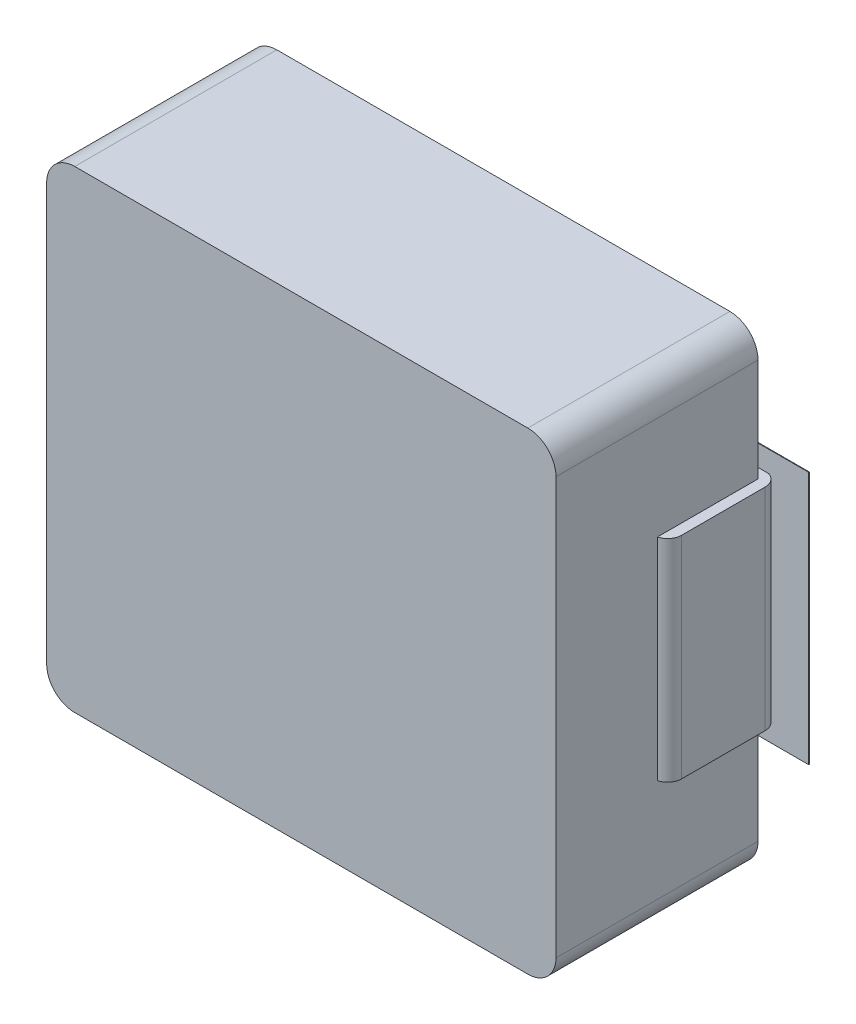
ISO-10303-21;
HEADER;
FILE_DESCRIPTION(('STEP AP214'),'2;1');
FILE_NAME('part.step','',(''),(''),'','','');
FILE_SCHEMA(('AUTOMOTIVE_DESIGN { 1 0 10303 214 1 1 1 1 }'));
ENDSEC;
DATA;
#1=APPLICATION_CONTEXT('core data for automotive mechanical design processes');
#2=APPLICATION_PROTOCOL_DEFINITION('international standard','automotive_design',2000,#1);
#3=PRODUCT_CONTEXT('',#1,'mechanical');
#4=PRODUCT('Part','Part','',(#3));
#5=PRODUCT_RELATED_PRODUCT_CATEGORY('part','',(#4));
#6=PRODUCT_DEFINITION_FORMATION('','',#4);
#7=PRODUCT_DEFINITION_CONTEXT('part definition',#1,'design');
#8=PRODUCT_DEFINITION('design','',#6,#7);
#9=PRODUCT_DEFINITION_SHAPE('','',#8);
#10=(LENGTH_UNIT() NAMED_UNIT(*) SI_UNIT(.MILLI.,.METRE.));
#11=(NAMED_UNIT(*) PLANE_ANGLE_UNIT() SI_UNIT($,.RADIAN.));
#12=(NAMED_UNIT(*) SI_UNIT($,.STERADIAN.) SOLID_ANGLE_UNIT());
#13=UNCERTAINTY_MEASURE_WITH_UNIT(LENGTH_MEASURE(1.E-05),#10,'distance_accuracy_value','');
#14=(GEOMETRIC_REPRESENTATION_CONTEXT(3) GLOBAL_UNCERTAINTY_ASSIGNED_CONTEXT((#13)) GLOBAL_UNIT_ASSIGNED_CONTEXT((#10,
#11,#12)) REPRESENTATION_CONTEXT('',''));
#15=CARTESIAN_POINT('',(0.,0.,0.));
#16=DIRECTION('',(0.,0.,1.));
#17=DIRECTION('',(1.,0.,0.));
#18=AXIS2_PLACEMENT_3D('',#15,#16,#17);
#19=CARTESIAN_POINT('',(3.57099999999994,-1.5000000000001,0.0762));
#20=DIRECTION('',(0.,0.,-1.));
#21=DIRECTION('',(-1.,0.,0.));
#22=AXIS2_PLACEMENT_3D('',#19,#20,#21);
#23=PLANE('',#22);
#24=DIRECTION('',(0.,1.,0.));
#25=VECTOR('',#24,1.);
#26=CARTESIAN_POINT('',(4.20000000000098,-1.79999999999991,0.0762));
#27=LINE('',#26,#25);
#28=CARTESIAN_POINT('',(4.20000000000098,-1.79999999999991,0.0762));
#29=VERTEX_POINT('',#28);
#30=CARTESIAN_POINT('',(4.20000000000098,1.79999999999991,0.0762));
#31=VERTEX_POINT('',#30);
#32=EDGE_CURVE('E1210',#29,#31,#27,.T.);
#33=ORIENTED_EDGE('',*,*,#32,.F.);
#34=DIRECTION('',(1.,0.,0.));
#35=VECTOR('',#34,1.);
#36=CARTESIAN_POINT('',(1.33000000000001,-1.79999999999991,0.0762));
#37=LINE('',#36,#35);
#38=CARTESIAN_POINT('',(1.33000000000001,-1.79999999999991,0.0762));
#39=VERTEX_POINT('',#38);
#40=EDGE_CURVE('E1214',#39,#29,#37,.T.);
#41=ORIENTED_EDGE('',*,*,#40,.F.);
#42=DIRECTION('',(0.,1.,0.));
#43=VECTOR('',#42,1.);
#44=CARTESIAN_POINT('',(1.33000000000001,1.79999999999991,0.0762));
#45=LINE('',#44,#43);
#46=CARTESIAN_POINT('',(1.33000000000001,1.79999999999991,0.0762));
#47=VERTEX_POINT('',#46);
#48=EDGE_CURVE('E1227',#47,#39,#45,.F.);
#49=ORIENTED_EDGE('',*,*,#48,.F.);
#50=DIRECTION('',(1.,0.,0.));
#51=VECTOR('',#50,1.);
#52=CARTESIAN_POINT('',(4.20000000000098,1.79999999999991,0.0762));
#53=LINE('',#52,#51);
#54=EDGE_CURVE('E1216',#31,#47,#53,.F.);
#55=ORIENTED_EDGE('',*,*,#54,.F.);
#56=EDGE_LOOP('',(#33,#41,#49,#55));
#57=FACE_BOUND('',#56,.T.);
#58=ADVANCED_FACE('F16',(#57),#23,.T.);
#59=CARTESIAN_POINT('',(3.57099999999994,-1.5000000000001,0.0762));
#60=DIRECTION('',(0.,0.,-1.));
#61=DIRECTION('',(-1.,0.,0.));
#62=AXIS2_PLACEMENT_3D('',#59,#60,#61);
#63=PLANE('',#62);
#64=DIRECTION('',(1.,0.,0.));
#65=VECTOR('',#64,1.);
#66=CARTESIAN_POINT('',(-4.20000000000098,-1.79999999999991,0.0762));
#67=LINE('',#66,#65);
#68=CARTESIAN_POINT('',(-4.20000000000098,-1.79999999999991,0.0762));
#69=VERTEX_POINT('',#68);
#70=CARTESIAN_POINT('',(-1.33000000000001,-1.79999999999991,0.0762));
#71=VERTEX_POINT('',#70);
#72=EDGE_CURVE('E1229',#69,#71,#67,.T.);
#73=ORIENTED_EDGE('',*,*,#72,.F.);
#74=DIRECTION('',(0.,1.,0.));
#75=VECTOR('',#74,1.);
#76=CARTESIAN_POINT('',(-4.20000000000098,1.79999999999991,0.0762));
#77=LINE('',#76,#75);
#78=CARTESIAN_POINT('',(-4.20000000000098,1.79999999999991,0.0762));
#79=VERTEX_POINT('',#78);
#80=EDGE_CURVE('E215',#79,#69,#77,.F.);
#81=ORIENTED_EDGE('',*,*,#80,.F.);
#82=DIRECTION('',(1.,0.,0.));
#83=VECTOR('',#82,1.);
#84=CARTESIAN_POINT('',(-1.33000000000001,1.79999999999991,0.0762));
#85=LINE('',#84,#83);
#86=CARTESIAN_POINT('',(-1.33000000000001,1.79999999999991,0.0762));
#87=VERTEX_POINT('',#86);
#88=EDGE_CURVE('E1293',#87,#79,#85,.F.);
#89=ORIENTED_EDGE('',*,*,#88,.F.);
#90=DIRECTION('',(0.,1.,0.));
#91=VECTOR('',#90,1.);
#92=CARTESIAN_POINT('',(-1.33000000000001,-1.79999999999991,0.0762));
#93=LINE('',#92,#91);
#94=EDGE_CURVE('E1298',#71,#87,#93,.T.);
#95=ORIENTED_EDGE('',*,*,#94,.F.);
#96=EDGE_LOOP('',(#73,#81,#89,#95));
#97=FACE_BOUND('',#96,.T.);
#98=ADVANCED_FACE('F1139',(#97),#63,.T.);
#99=CARTESIAN_POINT('',(4.20000000000098,-1.79999999999991,0.0762));
#100=DIRECTION('',(1.,0.,0.));
#101=DIRECTION('',(0.,0.,-1.));
#102=AXIS2_PLACEMENT_3D('',#99,#100,#101);
#103=PLANE('',#102);
#104=DIRECTION('',(0.,0.,-1.));
#105=VECTOR('',#104,1.);
#106=CARTESIAN_POINT('',(4.20000000000098,-1.79999999999991,0.0762));
#107=LINE('',#106,#105);
#108=CARTESIAN_POINT('',(4.20000000000098,-1.79999999999991,0.0851999999999894));
#109=VERTEX_POINT('',#108);
#110=EDGE_CURVE('E1221',#29,#109,#107,.F.);
#111=ORIENTED_EDGE('',*,*,#110,.F.);
#112=ORIENTED_EDGE('',*,*,#32,.T.);
#113=DIRECTION('',(0.,0.,1.));
#114=VECTOR('',#113,1.);
#115=CARTESIAN_POINT('',(4.20000000000098,1.79999999999991,0.0762));
#116=LINE('',#115,#114);
#117=CARTESIAN_POINT('',(4.20000000000098,1.79999999999991,0.0851999999999894));
#118=VERTEX_POINT('',#117);
#119=EDGE_CURVE('E1218',#118,#31,#116,.F.);
#120=ORIENTED_EDGE('',*,*,#119,.F.);
#121=DIRECTION('',(0.,1.,0.));
#122=VECTOR('',#121,1.);
#123=CARTESIAN_POINT('',(4.20000000000098,0.,0.0851999999999894));
#124=LINE('',#123,#122);
#125=EDGE_CURVE('E1223',#109,#118,#124,.T.);
#126=ORIENTED_EDGE('',*,*,#125,.F.);
#127=EDGE_LOOP('',(#111,#112,#120,#126));
#128=FACE_BOUND('',#127,.T.);
#129=ADVANCED_FACE('F1130',(#128),#103,.T.);
#130=CARTESIAN_POINT('',(4.20000000000098,1.79999999999991,0.0762));
#131=DIRECTION('',(0.,1.,0.));
#132=DIRECTION('',(0.,0.,1.));
#133=AXIS2_PLACEMENT_3D('',#130,#131,#132);
#134=PLANE('',#133);
#135=ORIENTED_EDGE('',*,*,#119,.T.);
#136=ORIENTED_EDGE('',*,*,#54,.T.);
#137=DIRECTION('',(0.,0.,1.));
#138=VECTOR('',#137,1.);
#139=CARTESIAN_POINT('',(1.33000000000001,1.79999999999991,0.0762));
#140=LINE('',#139,#138);
#141=CARTESIAN_POINT('',(1.33000000000001,1.79999999999991,0.0851999999999894));
#142=VERTEX_POINT('',#141);
#143=EDGE_CURVE('E1237',#142,#47,#140,.F.);
#144=ORIENTED_EDGE('',*,*,#143,.F.);
#145=DIRECTION('',(1.,0.,0.));
#146=VECTOR('',#145,1.);
#147=CARTESIAN_POINT('',(0.,1.79999999999991,0.0851999999999894));
#148=LINE('',#147,#146);
#149=EDGE_CURVE('E1332',#118,#142,#148,.F.);
#150=ORIENTED_EDGE('',*,*,#149,.F.);
#151=EDGE_LOOP('',(#135,#136,#144,#150));
#152=FACE_BOUND('',#151,.T.);
#153=ADVANCED_FACE('F1121',(#152),#134,.T.);
#154=CARTESIAN_POINT('',(1.33000000000001,1.79999999999991,0.0762));
#155=DIRECTION('',(-1.,0.,0.));
#156=DIRECTION('',(0.,0.,1.));
#157=AXIS2_PLACEMENT_3D('',#154,#155,#156);
#158=PLANE('',#157);
#159=ORIENTED_EDGE('',*,*,#143,.T.);
#160=ORIENTED_EDGE('',*,*,#48,.T.);
#161=DIRECTION('',(0.,0.,-1.));
#162=VECTOR('',#161,1.);
#163=CARTESIAN_POINT('',(1.33000000000001,-1.79999999999991,0.0762));
#164=LINE('',#163,#162);
#165=CARTESIAN_POINT('',(1.33000000000001,-1.79999999999991,0.0851999999999894));
#166=VERTEX_POINT('',#165);
#167=EDGE_CURVE('E1226',#166,#39,#164,.T.);
#168=ORIENTED_EDGE('',*,*,#167,.F.);
#169=DIRECTION('',(0.,1.,0.));
#170=VECTOR('',#169,1.);
#171=CARTESIAN_POINT('',(1.33000000000001,0.,0.0851999999999894));
#172=LINE('',#171,#170);
#173=EDGE_CURVE('E1327',#142,#166,#172,.F.);
#174=ORIENTED_EDGE('',*,*,#173,.F.);
#175=EDGE_LOOP('',(#159,#160,#168,#174));
#176=FACE_BOUND('',#175,.T.);
#177=ADVANCED_FACE('F1112',(#176),#158,.T.);
#178=CARTESIAN_POINT('',(1.33000000000001,-1.79999999999991,0.0762));
#179=DIRECTION('',(0.,-1.,0.));
#180=DIRECTION('',(0.,0.,-1.));
#181=AXIS2_PLACEMENT_3D('',#178,#179,#180);
#182=PLANE('',#181);
#183=ORIENTED_EDGE('',*,*,#167,.T.);
#184=ORIENTED_EDGE('',*,*,#40,.T.);
#185=ORIENTED_EDGE('',*,*,#110,.T.);
#186=DIRECTION('',(1.,0.,0.));
#187=VECTOR('',#186,1.);
#188=CARTESIAN_POINT('',(0.,-1.79999999999991,0.0851999999999894));
#189=LINE('',#188,#187);
#190=EDGE_CURVE('E1324',#166,#109,#189,.T.);
#191=ORIENTED_EDGE('',*,*,#190,.F.);
#192=EDGE_LOOP('',(#183,#184,#185,#191));
#193=FACE_BOUND('',#192,.T.);
#194=ADVANCED_FACE('F1103',(#193),#182,.T.);
#195=CARTESIAN_POINT('',(-4.20000000000098,-1.79999999999991,0.0762));
#196=DIRECTION('',(0.,-1.,0.));
#197=DIRECTION('',(0.,0.,-1.));
#198=AXIS2_PLACEMENT_3D('',#195,#196,#197);
#199=PLANE('',#198);
#200=DIRECTION('',(0.,0.,1.));
#201=VECTOR('',#200,1.);
#202=CARTESIAN_POINT('',(-4.20000000000098,-1.79999999999991,0.0762));
#203=LINE('',#202,#201);
#204=CARTESIAN_POINT('',(-4.20000000000098,-1.79999999999991,0.0851999999999894));
#205=VERTEX_POINT('',#204);
#206=EDGE_CURVE('E1290',#69,#205,#203,.T.);
#207=ORIENTED_EDGE('',*,*,#206,.F.);
#208=ORIENTED_EDGE('',*,*,#72,.T.);
#209=DIRECTION('',(0.,0.,-1.));
#210=VECTOR('',#209,1.);
#211=CARTESIAN_POINT('',(-1.33000000000001,-1.79999999999991,0.0762));
#212=LINE('',#211,#210);
#213=CARTESIAN_POINT('',(-1.33000000000001,-1.79999999999991,0.0851999999999894));
#214=VERTEX_POINT('',#213);
#215=EDGE_CURVE('E1231',#214,#71,#212,.T.);
#216=ORIENTED_EDGE('',*,*,#215,.F.);
#217=DIRECTION('',(1.,0.,0.));
#218=VECTOR('',#217,1.);
#219=CARTESIAN_POINT('',(0.,-1.79999999999991,0.0851999999999894));
#220=LINE('',#219,#218);
#221=EDGE_CURVE('E252',#205,#214,#220,.T.);
#222=ORIENTED_EDGE('',*,*,#221,.F.);
#223=EDGE_LOOP('',(#207,#208,#216,#222));
#224=FACE_BOUND('',#223,.T.);
#225=ADVANCED_FACE('F1094',(#224),#199,.T.);
#226=CARTESIAN_POINT('',(-1.33000000000001,-1.79999999999991,0.0762));
#227=DIRECTION('',(1.,0.,0.));
#228=DIRECTION('',(0.,0.,-1.));
#229=AXIS2_PLACEMENT_3D('',#226,#227,#228);
#230=PLANE('',#229);
#231=ORIENTED_EDGE('',*,*,#215,.T.);
#232=ORIENTED_EDGE('',*,*,#94,.T.);
#233=DIRECTION('',(0.,0.,1.));
#234=VECTOR('',#233,1.);
#235=CARTESIAN_POINT('',(-1.33000000000001,1.79999999999991,0.0762));
#236=LINE('',#235,#234);
#237=CARTESIAN_POINT('',(-1.33000000000001,1.79999999999991,0.0851999999999894));
#238=VERTEX_POINT('',#237);
#239=EDGE_CURVE('E1295',#238,#87,#236,.F.);
#240=ORIENTED_EDGE('',*,*,#239,.F.);
#241=DIRECTION('',(0.,1.,0.));
#242=VECTOR('',#241,1.);
#243=CARTESIAN_POINT('',(-1.33000000000001,0.,0.0851999999999894));
#244=LINE('',#243,#242);
#245=EDGE_CURVE('E249',#214,#238,#244,.T.);
#246=ORIENTED_EDGE('',*,*,#245,.F.);
#247=EDGE_LOOP('',(#231,#232,#240,#246));
#248=FACE_BOUND('',#247,.T.);
#249=ADVANCED_FACE('F1085',(#248),#230,.T.);
#250=CARTESIAN_POINT('',(-1.33000000000001,1.79999999999991,0.0762));
#251=DIRECTION('',(0.,1.,0.));
#252=DIRECTION('',(0.,0.,1.));
#253=AXIS2_PLACEMENT_3D('',#250,#251,#252);
#254=PLANE('',#253);
#255=ORIENTED_EDGE('',*,*,#239,.T.);
#256=ORIENTED_EDGE('',*,*,#88,.T.);
#257=DIRECTION('',(0.,0.,1.));
#258=VECTOR('',#257,1.);
#259=CARTESIAN_POINT('',(-4.20000000000098,1.79999999999991,0.0762));
#260=LINE('',#259,#258);
#261=CARTESIAN_POINT('',(-4.20000000000098,1.79999999999991,0.0851999999999894));
#262=VERTEX_POINT('',#261);
#263=EDGE_CURVE('E1287',#262,#79,#260,.F.);
#264=ORIENTED_EDGE('',*,*,#263,.F.);
#265=DIRECTION('',(1.,0.,0.));
#266=VECTOR('',#265,1.);
#267=CARTESIAN_POINT('',(0.,1.79999999999991,0.0851999999999894));
#268=LINE('',#267,#266);
#269=EDGE_CURVE('E246',#238,#262,#268,.F.);
#270=ORIENTED_EDGE('',*,*,#269,.F.);
#271=EDGE_LOOP('',(#255,#256,#264,#270));
#272=FACE_BOUND('',#271,.T.);
#273=ADVANCED_FACE('F1076',(#272),#254,.T.);
#274=CARTESIAN_POINT('',(-4.20000000000098,1.79999999999991,0.0762));
#275=DIRECTION('',(-1.,0.,0.));
#276=DIRECTION('',(0.,0.,1.));
#277=AXIS2_PLACEMENT_3D('',#274,#275,#276);
#278=PLANE('',#277);
#279=ORIENTED_EDGE('',*,*,#263,.T.);
#280=ORIENTED_EDGE('',*,*,#80,.T.);
#281=ORIENTED_EDGE('',*,*,#206,.T.);
#282=DIRECTION('',(0.,1.,0.));
#283=VECTOR('',#282,1.);
#284=CARTESIAN_POINT('',(-4.20000000000098,0.,0.0851999999999894));
#285=LINE('',#284,#283);
#286=EDGE_CURVE('E243',#262,#205,#285,.F.);
#287=ORIENTED_EDGE('',*,*,#286,.F.);
#288=EDGE_LOOP('',(#279,#280,#281,#287));
#289=FACE_BOUND('',#288,.T.);
#290=ADVANCED_FACE('F1069',(#289),#278,.T.);
#291=CARTESIAN_POINT('',(-3.57099999999994,-1.5000000000001,0.276199999999962));
#292=DIRECTION('',(0.,1.,0.));
#293=DIRECTION('',(0.,0.,1.));
#294=AXIS2_PLACEMENT_3D('',#291,#292,#293);
#295=CYLINDRICAL_SURFACE('',#294,0.199999999999987);
#296=CARTESIAN_POINT('',(-3.57099999999994,1.5000000000001,0.276199999999962));
#297=DIRECTION('',(0.,-1.,0.));
#298=DIRECTION('',(-1.,0.,0.));
#299=AXIS2_PLACEMENT_3D('',#296,#297,#298);
#300=CIRCLE('',#299,0.199999999999988);
#301=CARTESIAN_POINT('',(-3.77099999999934,1.5000000000001,0.276199999999962));
#302=VERTEX_POINT('',#301);
#303=CARTESIAN_POINT('',(-3.63032115980035,1.5000000000001,0.0852000000000261));
#304=VERTEX_POINT('',#303);
#305=EDGE_CURVE('E214',#302,#304,#300,.T.);
#306=ORIENTED_EDGE('',*,*,#305,.T.);
#307=DIRECTION('',(0.,1.,0.));
#308=VECTOR('',#307,1.);
#309=CARTESIAN_POINT('',(-3.63032115980036,0.,0.0851999999999894));
#310=LINE('',#309,#308);
#311=CARTESIAN_POINT('',(-3.63032115980035,-1.5000000000001,0.0852000000000261));
#312=VERTEX_POINT('',#311);
#313=EDGE_CURVE('E210',#312,#304,#310,.T.);
#314=ORIENTED_EDGE('',*,*,#313,.F.);
#315=CARTESIAN_POINT('',(-3.57099999999994,-1.5000000000001,0.276199999999962));
#316=DIRECTION('',(0.,1.,0.));
#317=DIRECTION('',(-0.296605799001891,0.,-0.954999999999188));
#318=AXIS2_PLACEMENT_3D('',#315,#316,#317);
#319=CIRCLE('',#318,0.199999999999987);
#320=CARTESIAN_POINT('',(-3.77099999999934,-1.5000000000001,0.276199999999962));
#321=VERTEX_POINT('',#320);
#322=EDGE_CURVE('E203',#312,#321,#319,.T.);
#323=ORIENTED_EDGE('',*,*,#322,.T.);
#324=DIRECTION('',(0.,1.,0.));
#325=VECTOR('',#324,1.);
#326=CARTESIAN_POINT('',(-3.77099999999914,-1.5000000000001,0.276199999999962));
#327=LINE('',#326,#325);
#328=EDGE_CURVE('E207',#302,#321,#327,.F.);
#329=ORIENTED_EDGE('',*,*,#328,.F.);
#330=EDGE_LOOP('',(#306,#314,#323,#329));
#331=FACE_BOUND('',#330,.T.);
#332=ADVANCED_FACE('F205',(#331),#295,.T.);
#333=CARTESIAN_POINT('',(3.57099999999994,-1.5000000000001,0.276199999999962));
#334=DIRECTION('',(0.,1.,0.));
#335=DIRECTION('',(0.,0.,1.));
#336=AXIS2_PLACEMENT_3D('',#333,#334,#335);
#337=CYLINDRICAL_SURFACE('',#336,0.199999999999987);
#338=CARTESIAN_POINT('',(3.57099999999994,-1.5000000000001,0.276199999999962));
#339=DIRECTION('',(0.,1.,0.));
#340=DIRECTION('',(1.,0.,0.));
#341=AXIS2_PLACEMENT_3D('',#338,#339,#340);
#342=CIRCLE('',#341,0.199999999999988);
#343=CARTESIAN_POINT('',(3.77099999999934,-1.5000000000001,0.276199999999962));
#344=VERTEX_POINT('',#343);
#345=CARTESIAN_POINT('',(3.63032115980035,-1.5000000000001,0.0852000000000261));
#346=VERTEX_POINT('',#345);
#347=EDGE_CURVE('E1245',#344,#346,#342,.T.);
#348=ORIENTED_EDGE('',*,*,#347,.T.);
#349=DIRECTION('',(0.,1.,0.));
#350=VECTOR('',#349,1.);
#351=CARTESIAN_POINT('',(3.63032115980036,0.,0.0851999999999894));
#352=LINE('',#351,#350);
#353=CARTESIAN_POINT('',(3.63032115980035,1.5000000000001,0.0852000000000261));
#354=VERTEX_POINT('',#353);
#355=EDGE_CURVE('E254',#354,#346,#352,.F.);
#356=ORIENTED_EDGE('',*,*,#355,.F.);
#357=CARTESIAN_POINT('',(3.57099999999994,1.5000000000001,0.276199999999962));
#358=DIRECTION('',(0.,-1.,0.));
#359=DIRECTION('',(0.296605799001891,0.,-0.954999999999188));
#360=AXIS2_PLACEMENT_3D('',#357,#358,#359);
#361=CIRCLE('',#360,0.199999999999987);
#362=CARTESIAN_POINT('',(3.77099999999934,1.5000000000001,0.276199999999962));
#363=VERTEX_POINT('',#362);
#364=EDGE_CURVE('E1275',#354,#363,#361,.T.);
#365=ORIENTED_EDGE('',*,*,#364,.T.);
#366=DIRECTION('',(0.,1.,0.));
#367=VECTOR('',#366,1.);
#368=CARTESIAN_POINT('',(3.77099999999914,-1.5000000000001,0.276199999999962));
#369=LINE('',#368,#367);
#370=EDGE_CURVE('E227',#344,#363,#369,.T.);
#371=ORIENTED_EDGE('',*,*,#370,.F.);
#372=EDGE_LOOP('',(#348,#356,#365,#371));
#373=FACE_BOUND('',#372,.T.);
#374=ADVANCED_FACE('F1050',(#373),#337,.T.);
#375=CARTESIAN_POINT('',(0.,0.,0.0851999999999894));
#376=DIRECTION('',(0.,0.,1.));
#377=DIRECTION('',(1.,0.,0.));
#378=AXIS2_PLACEMENT_3D('',#375,#376,#377);
#379=PLANE('',#378);
#380=ORIENTED_EDGE('',*,*,#355,.T.);
#381=DIRECTION('',(1.,0.,0.));
#382=VECTOR('',#381,1.);
#383=CARTESIAN_POINT('',(0.,-1.5000000000001,0.0851999999999894));
#384=LINE('',#383,#382);
#385=CARTESIAN_POINT('',(1.98049999999995,-1.5000000000001,0.0851999999999894));
#386=VERTEX_POINT('',#385);
#387=EDGE_CURVE('E263',#346,#386,#384,.F.);
#388=ORIENTED_EDGE('',*,*,#387,.T.);
#389=DIRECTION('',(0.,1.,0.));
#390=VECTOR('',#389,1.);
#391=CARTESIAN_POINT('',(1.98049999999995,-1.5000000000001,0.0851999999999894));
#392=LINE('',#391,#390);
#393=CARTESIAN_POINT('',(1.98049999999995,1.5000000000001,0.0851999999999894));
#394=VERTEX_POINT('',#393);
#395=EDGE_CURVE('E1339',#394,#386,#392,.F.);
#396=ORIENTED_EDGE('',*,*,#395,.F.);
#397=DIRECTION('',(1.,0.,0.));
#398=VECTOR('',#397,1.);
#399=CARTESIAN_POINT('',(0.,1.5000000000001,0.0851999999999894));
#400=LINE('',#399,#398);
#401=EDGE_CURVE('E1307',#394,#354,#400,.T.);
#402=ORIENTED_EDGE('',*,*,#401,.T.);
#403=EDGE_LOOP('',(#380,#388,#396,#402));
#404=FACE_BOUND('',#403,.T.);
#405=ORIENTED_EDGE('',*,*,#173,.T.);
#406=ORIENTED_EDGE('',*,*,#190,.T.);
#407=ORIENTED_EDGE('',*,*,#125,.T.);
#408=ORIENTED_EDGE('',*,*,#149,.T.);
#409=EDGE_LOOP('',(#405,#406,#407,#408));
#410=FACE_BOUND('',#409,.T.);
#411=ADVANCED_FACE('F1041',(#404,#410),#379,.T.);
#412=CARTESIAN_POINT('',(0.,0.,0.0851999999999894));
#413=DIRECTION('',(0.,0.,1.));
#414=DIRECTION('',(1.,0.,0.));
#415=AXIS2_PLACEMENT_3D('',#412,#413,#414);
#416=PLANE('',#415);
#417=DIRECTION('',(0.,1.,0.));
#418=VECTOR('',#417,1.);
#419=CARTESIAN_POINT('',(-1.98049999999995,-1.5000000000001,0.0851999999999894));
#420=LINE('',#419,#418);
#421=CARTESIAN_POINT('',(-1.98049999999995,-1.5000000000001,0.0851999999999894));
#422=VERTEX_POINT('',#421);
#423=CARTESIAN_POINT('',(-1.98049999999995,1.5000000000001,0.0851999999999894));
#424=VERTEX_POINT('',#423);
#425=EDGE_CURVE('E1370',#422,#424,#420,.T.);
#426=ORIENTED_EDGE('',*,*,#425,.F.);
#427=DIRECTION('',(1.,0.,0.));
#428=VECTOR('',#427,1.);
#429=CARTESIAN_POINT('',(0.,-1.5000000000001,0.0851999999999894));
#430=LINE('',#429,#428);
#431=EDGE_CURVE('E231',#422,#312,#430,.F.);
#432=ORIENTED_EDGE('',*,*,#431,.T.);
#433=ORIENTED_EDGE('',*,*,#313,.T.);
#434=DIRECTION('',(1.,0.,0.));
#435=VECTOR('',#434,1.);
#436=CARTESIAN_POINT('',(0.,1.5000000000001,0.0851999999999894));
#437=LINE('',#436,#435);
#438=EDGE_CURVE('E233',#304,#424,#437,.T.);
#439=ORIENTED_EDGE('',*,*,#438,.T.);
#440=EDGE_LOOP('',(#426,#432,#433,#439));
#441=FACE_BOUND('',#440,.T.);
#442=ORIENTED_EDGE('',*,*,#269,.T.);
#443=ORIENTED_EDGE('',*,*,#286,.T.);
#444=ORIENTED_EDGE('',*,*,#221,.T.);
#445=ORIENTED_EDGE('',*,*,#245,.T.);
#446=EDGE_LOOP('',(#442,#443,#444,#445));
#447=FACE_BOUND('',#446,.T.);
#448=ADVANCED_FACE('F1034',(#441,#447),#416,.T.);
#449=CARTESIAN_POINT('',(-3.77099999999914,-1.5000000000001,0.276199999999962));
#450=DIRECTION('',(-1.,0.,0.));
#451=DIRECTION('',(0.,0.,1.));
#452=AXIS2_PLACEMENT_3D('',#449,#450,#451);
#453=PLANE('',#452);
#454=ORIENTED_EDGE('',*,*,#328,.T.);
#455=DIRECTION('',(0.,0.,1.));
#456=VECTOR('',#455,1.);
#457=CARTESIAN_POINT('',(-3.77099999999914,-1.5000000000001,0.276199999999962));
#458=LINE('',#457,#456);
#459=CARTESIAN_POINT('',(-3.77099999999953,-1.5000000000001,1.46249999999999));
#460=VERTEX_POINT('',#459);
#461=EDGE_CURVE('E218',#321,#460,#458,.T.);
#462=ORIENTED_EDGE('',*,*,#461,.T.);
#463=DIRECTION('',(0.,1.,0.));
#464=VECTOR('',#463,1.);
#465=CARTESIAN_POINT('',(-3.77099999999993,-1.5000000000001,1.46249999999999));
#466=LINE('',#465,#464);
#467=CARTESIAN_POINT('',(-3.77099999999953,1.5000000000001,1.46249999999999));
#468=VERTEX_POINT('',#467);
#469=EDGE_CURVE('E600',#468,#460,#466,.F.);
#470=ORIENTED_EDGE('',*,*,#469,.F.);
#471=DIRECTION('',(0.,0.,1.));
#472=VECTOR('',#471,1.);
#473=CARTESIAN_POINT('',(-3.77099999999914,1.5000000000001,0.0762));
#474=LINE('',#473,#472);
#475=EDGE_CURVE('E230',#302,#468,#474,.T.);
#476=ORIENTED_EDGE('',*,*,#475,.F.);
#477=EDGE_LOOP('',(#454,#462,#470,#476));
#478=FACE_BOUND('',#477,.T.);
#479=ADVANCED_FACE('F229',(#478),#453,.T.);
#480=CARTESIAN_POINT('',(3.77099999999914,-1.5000000000001,1.46249999999999));
#481=DIRECTION('',(1.,0.,0.));
#482=DIRECTION('',(0.,0.,-1.));
#483=AXIS2_PLACEMENT_3D('',#480,#481,#482);
#484=PLANE('',#483);
#485=DIRECTION('',(0.,1.,0.));
#486=VECTOR('',#485,1.);
#487=CARTESIAN_POINT('',(3.77099999999993,-1.5000000000001,1.46249999999999));
#488=LINE('',#487,#486);
#489=CARTESIAN_POINT('',(3.77099999999953,-1.5000000000001,1.46249999999999));
#490=VERTEX_POINT('',#489);
#491=CARTESIAN_POINT('',(3.77099999999953,1.5000000000001,1.46249999999999));
#492=VERTEX_POINT('',#491);
#493=EDGE_CURVE('E511',#490,#492,#488,.T.);
#494=ORIENTED_EDGE('',*,*,#493,.F.);
#495=DIRECTION('',(0.,0.,1.));
#496=VECTOR('',#495,1.);
#497=CARTESIAN_POINT('',(3.77099999999914,-1.5000000000001,0.0762));
#498=LINE('',#497,#496);
#499=EDGE_CURVE('E828',#490,#344,#498,.F.);
#500=ORIENTED_EDGE('',*,*,#499,.T.);
#501=ORIENTED_EDGE('',*,*,#370,.T.);
#502=DIRECTION('',(0.,0.,1.));
#503=VECTOR('',#502,1.);
#504=CARTESIAN_POINT('',(3.77099999999914,1.5000000000001,0.0762));
#505=LINE('',#504,#503);
#506=EDGE_CURVE('E1369',#492,#363,#505,.F.);
#507=ORIENTED_EDGE('',*,*,#506,.F.);
#508=EDGE_LOOP('',(#494,#500,#501,#507));
#509=FACE_BOUND('',#508,.T.);
#510=ADVANCED_FACE('F349',(#509),#484,.T.);
#511=CARTESIAN_POINT('',(0.,-1.5000000000001,0.0762));
#512=DIRECTION('',(0.,1.,0.));
#513=DIRECTION('',(0.,0.,1.));
#514=AXIS2_PLACEMENT_3D('',#511,#512,#513);
#515=PLANE('',#514);
#516=ORIENTED_EDGE('',*,*,#499,.F.);
#517=CARTESIAN_POINT('',(3.57099999999994,-1.5000000000001,1.46249999999999));
#518=DIRECTION('',(0.,1.,0.));
#519=DIRECTION('',(0.245000000003793,0.,0.969523078631005));
#520=AXIS2_PLACEMENT_3D('',#517,#518,#519);
#521=CIRCLE('',#520,0.199999999999987);
#522=CARTESIAN_POINT('',(3.62000000000075,-1.5000000000001,1.65640461572638));
#523=VERTEX_POINT('',#522);
#524=EDGE_CURVE('E518',#523,#490,#521,.T.);
#525=ORIENTED_EDGE('',*,*,#524,.F.);
#526=CARTESIAN_POINT('',(3.62000000000076,-1.5000000000001,1.46623746859286));
#527=DIRECTION('',(0.,0.,1.));
#528=VECTOR('',#527,1.);
#529=LINE('',#526,#528);
#530=CARTESIAN_POINT('',(3.62048253594978,-1.5000000000001,1.46623746859234));
#531=VERTEX_POINT('',#530);
#532=EDGE_CURVE('E332',#531,#523,#529,.T.);
#533=ORIENTED_EDGE('',*,*,#532,.F.);
#534=CARTESIAN_POINT('',(3.62099999999974,-1.5000000000001,0.27246253140735));
#535=DIRECTION('',(0.,0.,1.));
#536=VECTOR('',#535,1.);
#537=LINE('',#534,#536);
#538=CARTESIAN_POINT('',(3.62048253594979,-1.5000000000001,0.272462531407351));
#539=VERTEX_POINT('',#538);
#540=EDGE_CURVE('E425',#539,#531,#537,.T.);
#541=ORIENTED_EDGE('',*,*,#540,.F.);
#542=CARTESIAN_POINT('',(3.62000000000076,-1.5000000000001,0.22620000000001));
#543=DIRECTION('',(0.,0.,1.));
#544=VECTOR('',#543,1.);
#545=LINE('',#542,#544);
#546=CARTESIAN_POINT('',(3.62000000000076,-1.5000000000001,0.22620000000001));
#547=VERTEX_POINT('',#546);
#548=EDGE_CURVE('E774',#547,#539,#545,.T.);
#549=ORIENTED_EDGE('',*,*,#548,.F.);
#550=DIRECTION('',(1.,0.,0.));
#551=VECTOR('',#550,1.);
#552=CARTESIAN_POINT('',(0.,-1.5000000000001,0.22620000000001));
#553=LINE('',#552,#551);
#554=CARTESIAN_POINT('',(1.98049999999995,-1.5000000000001,0.22620000000001));
#555=VERTEX_POINT('',#554);
#556=EDGE_CURVE('E1362',#547,#555,#553,.F.);
#557=ORIENTED_EDGE('',*,*,#556,.T.);
#558=DIRECTION('',(0.,0.,1.));
#559=VECTOR('',#558,1.);
#560=CARTESIAN_POINT('',(1.98049999999995,-1.5000000000001,0.0762));
#561=LINE('',#560,#559);
#562=EDGE_CURVE('E1342',#386,#555,#561,.T.);
#563=ORIENTED_EDGE('',*,*,#562,.F.);
#564=ORIENTED_EDGE('',*,*,#387,.F.);
#565=ORIENTED_EDGE('',*,*,#347,.F.);
#566=EDGE_LOOP('',(#516,#525,#533,#541,#549,#557,#563,#564,#565));
#567=FACE_BOUND('',#566,.T.);
#568=ADVANCED_FACE('F338',(#567),#515,.F.);
#569=CARTESIAN_POINT('',(1.98049999999995,-1.5000000000001,0.0762));
#570=DIRECTION('',(-1.,0.,0.));
#571=DIRECTION('',(0.,0.,1.));
#572=AXIS2_PLACEMENT_3D('',#569,#570,#571);
#573=PLANE('',#572);
#574=DIRECTION('',(0.,0.,1.));
#575=VECTOR('',#574,1.);
#576=CARTESIAN_POINT('',(1.98049999999995,1.5000000000001,0.0762));
#577=LINE('',#576,#575);
#578=CARTESIAN_POINT('',(1.98049999999995,1.5000000000001,0.22620000000001));
#579=VERTEX_POINT('',#578);
#580=EDGE_CURVE('E1341',#394,#579,#577,.T.);
#581=ORIENTED_EDGE('',*,*,#580,.F.);
#582=ORIENTED_EDGE('',*,*,#395,.T.);
#583=ORIENTED_EDGE('',*,*,#562,.T.);
#584=DIRECTION('',(0.,1.,0.));
#585=VECTOR('',#584,1.);
#586=CARTESIAN_POINT('',(1.98049999999995,0.,0.22620000000001));
#587=LINE('',#586,#585);
#588=EDGE_CURVE('E772',#555,#579,#587,.T.);
#589=ORIENTED_EDGE('',*,*,#588,.T.);
#590=EDGE_LOOP('',(#581,#582,#583,#589));
#591=FACE_BOUND('',#590,.T.);
#592=ADVANCED_FACE('F348',(#591),#573,.T.);
#593=CARTESIAN_POINT('',(0.,1.5000000000001,0.0762));
#594=DIRECTION('',(0.,1.,0.));
#595=DIRECTION('',(0.,0.,1.));
#596=AXIS2_PLACEMENT_3D('',#593,#594,#595);
#597=PLANE('',#596);
#598=ORIENTED_EDGE('',*,*,#364,.F.);
#599=ORIENTED_EDGE('',*,*,#401,.F.);
#600=ORIENTED_EDGE('',*,*,#580,.T.);
#601=DIRECTION('',(1.,0.,0.));
#602=VECTOR('',#601,1.);
#603=CARTESIAN_POINT('',(0.,1.5000000000001,0.22620000000001));
#604=LINE('',#603,#602);
#605=CARTESIAN_POINT('',(3.62000000000076,1.5000000000001,0.22620000000001));
#606=VERTEX_POINT('',#605);
#607=EDGE_CURVE('E770',#579,#606,#604,.T.);
#608=ORIENTED_EDGE('',*,*,#607,.T.);
#609=DIRECTION('',(0.,0.,1.));
#610=VECTOR('',#609,1.);
#611=CARTESIAN_POINT('',(3.62000000000076,1.5000000000001,0.0762));
#612=LINE('',#611,#610);
#613=CARTESIAN_POINT('',(3.62066481936839,1.49999655764594,0.271207828396327));
#614=VERTEX_POINT('',#613);
#615=EDGE_CURVE('E764',#606,#614,#612,.T.);
#616=ORIENTED_EDGE('',*,*,#615,.T.);
#617=CARTESIAN_POINT('',(3.62099999999974,1.5000000000001,1.46623746859286));
#618=DIRECTION('',(0.,0.,-1.));
#619=VECTOR('',#618,1.);
#620=LINE('',#617,#619);
#621=CARTESIAN_POINT('',(3.62050723925003,1.5000000000001,1.46623746859225));
#622=VERTEX_POINT('',#621);
#623=EDGE_CURVE('E382',#622,#614,#620,.T.);
#624=ORIENTED_EDGE('',*,*,#623,.F.);
#625=CARTESIAN_POINT('',(3.62056234296308,1.5000000000001,1.46623746854569));
#626=DIRECTION('',(-0.00295708544818757,0.,0.999995627813268));
#627=VECTOR('',#626,1.);
#628=LINE('',#625,#627);
#629=CARTESIAN_POINT('',(3.62000000000075,1.5000000000001,1.65640461572638));
#630=VERTEX_POINT('',#629);
#631=EDGE_CURVE('E270',#622,#630,#628,.T.);
#632=ORIENTED_EDGE('',*,*,#631,.T.);
#633=CARTESIAN_POINT('',(3.57099999999994,1.5000000000001,1.46249999999999));
#634=DIRECTION('',(0.,-1.,0.));
#635=DIRECTION('',(1.,0.,0.));
#636=AXIS2_PLACEMENT_3D('',#633,#634,#635);
#637=CIRCLE('',#636,0.199999999999988);
#638=EDGE_CURVE('E474',#492,#630,#637,.T.);
#639=ORIENTED_EDGE('',*,*,#638,.F.);
#640=ORIENTED_EDGE('',*,*,#506,.T.);
#641=EDGE_LOOP('',(#598,#599,#600,#608,#616,#624,#632,#639,#640));
#642=FACE_BOUND('',#641,.T.);
#643=ADVANCED_FACE('F480',(#642),#597,.T.);
#644=CARTESIAN_POINT('',(-1.98049999999995,-1.5000000000001,0.22620000000001));
#645=DIRECTION('',(1.,0.,0.));
#646=DIRECTION('',(0.,0.,-1.));
#647=AXIS2_PLACEMENT_3D('',#644,#645,#646);
#648=PLANE('',#647);
#649=DIRECTION('',(0.,0.,1.));
#650=VECTOR('',#649,1.);
#651=CARTESIAN_POINT('',(-1.98049999999995,-1.5000000000001,0.0762));
#652=LINE('',#651,#650);
#653=CARTESIAN_POINT('',(-1.98049999999995,-1.5000000000001,0.22620000000001));
#654=VERTEX_POINT('',#653);
#655=EDGE_CURVE('E588',#654,#422,#652,.F.);
#656=ORIENTED_EDGE('',*,*,#655,.T.);
#657=ORIENTED_EDGE('',*,*,#425,.T.);
#658=DIRECTION('',(0.,0.,1.));
#659=VECTOR('',#658,1.);
#660=CARTESIAN_POINT('',(-1.98049999999995,1.5000000000001,0.0762));
#661=LINE('',#660,#659);
#662=CARTESIAN_POINT('',(-1.98049999999995,1.5000000000001,0.22620000000001));
#663=VERTEX_POINT('',#662);
#664=EDGE_CURVE('E607',#663,#424,#661,.F.);
#665=ORIENTED_EDGE('',*,*,#664,.F.);
#666=DIRECTION('',(0.,1.,0.));
#667=VECTOR('',#666,1.);
#668=CARTESIAN_POINT('',(-1.98049999999995,0.,0.22620000000001));
#669=LINE('',#668,#667);
#670=EDGE_CURVE('E790',#663,#654,#669,.F.);
#671=ORIENTED_EDGE('',*,*,#670,.T.);
#672=EDGE_LOOP('',(#656,#657,#665,#671));
#673=FACE_BOUND('',#672,.T.);
#674=ADVANCED_FACE('F489',(#673),#648,.T.);
#675=CARTESIAN_POINT('',(0.,1.5000000000001,0.0762));
#676=DIRECTION('',(0.,1.,0.));
#677=DIRECTION('',(0.,0.,1.));
#678=AXIS2_PLACEMENT_3D('',#675,#676,#677);
#679=PLANE('',#678);
#680=ORIENTED_EDGE('',*,*,#664,.T.);
#681=ORIENTED_EDGE('',*,*,#438,.F.);
#682=ORIENTED_EDGE('',*,*,#305,.F.);
#683=ORIENTED_EDGE('',*,*,#475,.T.);
#684=CARTESIAN_POINT('',(-3.57099999999994,1.5000000000001,1.46249999999999));
#685=DIRECTION('',(0.,-1.,0.));
#686=DIRECTION('',(-0.249999999998913,0.,0.968245836552135));
#687=AXIS2_PLACEMENT_3D('',#684,#685,#686);
#688=CIRCLE('',#687,0.199999999999987);
#689=CARTESIAN_POINT('',(-3.62099999999973,1.5000000000001,1.65614916731046));
#690=VERTEX_POINT('',#689);
#691=EDGE_CURVE('E604',#690,#468,#688,.T.);
#692=ORIENTED_EDGE('',*,*,#691,.F.);
#693=DIRECTION('',(0.,0.,1.));
#694=VECTOR('',#693,1.);
#695=CARTESIAN_POINT('',(-3.62099999999974,1.5000000000001,0.0762));
#696=LINE('',#695,#694);
#697=CARTESIAN_POINT('',(-3.62099999999974,1.5000000000001,0.22620000000001));
#698=VERTEX_POINT('',#697);
#699=EDGE_CURVE('E625',#698,#690,#696,.T.);
#700=ORIENTED_EDGE('',*,*,#699,.F.);
#701=DIRECTION('',(1.,0.,0.));
#702=VECTOR('',#701,1.);
#703=CARTESIAN_POINT('',(0.,1.5000000000001,0.22620000000001));
#704=LINE('',#703,#702);
#705=EDGE_CURVE('E792',#698,#663,#704,.T.);
#706=ORIENTED_EDGE('',*,*,#705,.T.);
#707=EDGE_LOOP('',(#680,#681,#682,#683,#692,#700,#706));
#708=FACE_BOUND('',#707,.T.);
#709=ADVANCED_FACE('F623',(#708),#679,.T.);
#710=CARTESIAN_POINT('',(-3.57099999999994,-1.5000000000001,1.46249999999999));
#711=DIRECTION('',(0.,1.,0.));
#712=DIRECTION('',(0.,0.,1.));
#713=AXIS2_PLACEMENT_3D('',#710,#711,#712);
#714=CYLINDRICAL_SURFACE('',#713,0.199999999999987);
#715=CARTESIAN_POINT('',(-3.57099999999994,-1.5000000000001,1.46249999999999));
#716=DIRECTION('',(0.,1.,0.));
#717=DIRECTION('',(-1.,0.,0.));
#718=AXIS2_PLACEMENT_3D('',#715,#716,#717);
#719=CIRCLE('',#718,0.199999999999988);
#720=CARTESIAN_POINT('',(-3.62099999999973,-1.5000000000001,1.65614916731046));
#721=VERTEX_POINT('',#720);
#722=EDGE_CURVE('E222',#460,#721,#719,.T.);
#723=ORIENTED_EDGE('',*,*,#722,.T.);
#724=DIRECTION('',(0.,1.,0.));
#725=VECTOR('',#724,1.);
#726=CARTESIAN_POINT('',(-3.62099999999974,2.96199999999882,1.65614916731048));
#727=LINE('',#726,#725);
#728=EDGE_CURVE('E617',#690,#721,#727,.F.);
#729=ORIENTED_EDGE('',*,*,#728,.F.);
#730=ORIENTED_EDGE('',*,*,#691,.T.);
#731=ORIENTED_EDGE('',*,*,#469,.T.);
#732=EDGE_LOOP('',(#723,#729,#730,#731));
#733=FACE_BOUND('',#732,.T.);
#734=ADVANCED_FACE('F615',(#733),#714,.T.);
#735=CARTESIAN_POINT('',(0.,-1.5000000000001,0.0762));
#736=DIRECTION('',(0.,1.,0.));
#737=DIRECTION('',(0.,0.,1.));
#738=AXIS2_PLACEMENT_3D('',#735,#736,#737);
#739=PLANE('',#738);
#740=DIRECTION('',(1.,0.,0.));
#741=VECTOR('',#740,1.);
#742=CARTESIAN_POINT('',(0.,-1.5000000000001,0.22620000000001));
#743=LINE('',#742,#741);
#744=CARTESIAN_POINT('',(-3.62099999999974,-1.5000000000001,0.22620000000001));
#745=VERTEX_POINT('',#744);
#746=EDGE_CURVE('E778',#654,#745,#743,.F.);
#747=ORIENTED_EDGE('',*,*,#746,.T.);
#748=DIRECTION('',(0.,0.,1.));
#749=VECTOR('',#748,1.);
#750=CARTESIAN_POINT('',(-3.62099999999974,-1.5000000000001,0.0762));
#751=LINE('',#750,#749);
#752=EDGE_CURVE('E674',#721,#745,#751,.F.);
#753=ORIENTED_EDGE('',*,*,#752,.F.);
#754=ORIENTED_EDGE('',*,*,#722,.F.);
#755=ORIENTED_EDGE('',*,*,#461,.F.);
#756=ORIENTED_EDGE('',*,*,#322,.F.);
#757=ORIENTED_EDGE('',*,*,#431,.F.);
#758=ORIENTED_EDGE('',*,*,#655,.F.);
#759=EDGE_LOOP('',(#747,#753,#754,#755,#756,#757,#758));
#760=FACE_BOUND('',#759,.T.);
#761=ADVANCED_FACE('F220',(#760),#739,.F.);
#762=CARTESIAN_POINT('',(-3.2210002988298,-2.96200029882982,0.0762));
#763=DIRECTION('',(0.,0.,1.));
#764=DIRECTION('',(1.,0.,0.));
#765=AXIS2_PLACEMENT_3D('',#762,#763,#764);
#766=CYLINDRICAL_SURFACE('',#765,0.39999970116994);
#767=DIRECTION('',(0.,0.,1.));
#768=VECTOR('',#767,1.);
#769=CARTESIAN_POINT('',(-3.62099999999974,-2.96200029882982,0.0762));
#770=LINE('',#769,#768);
#771=CARTESIAN_POINT('',(-3.62099999999971,-2.96200022412207,0.22620000000001));
#772=VERTEX_POINT('',#771);
#773=CARTESIAN_POINT('',(-3.62099999999971,-2.96200007470657,3.0988));
#774=VERTEX_POINT('',#773);
#775=EDGE_CURVE('E688',#772,#774,#770,.T.);
#776=ORIENTED_EDGE('',*,*,#775,.F.);
#777=CARTESIAN_POINT('',(-3.2210002988298,-2.96200029882982,0.22620000000001));
#778=DIRECTION('',(0.,0.,1.));
#779=DIRECTION('',(-0.999999999999721,7.47078056728802E-07,0.));
#780=AXIS2_PLACEMENT_3D('',#777,#778,#779);
#781=CIRCLE('',#780,0.39999970116994);
#782=CARTESIAN_POINT('',(-3.2210001494143,-3.36199999999976,0.22620000000001));
#783=VERTEX_POINT('',#782);
#784=EDGE_CURVE('E583',#772,#783,#781,.T.);
#785=ORIENTED_EDGE('',*,*,#784,.T.);
#786=DIRECTION('',(0.,0.,-1.));
#787=VECTOR('',#786,1.);
#788=CARTESIAN_POINT('',(-3.2209999999988,-3.36199999999976,0.0762));
#789=LINE('',#788,#787);
#790=CARTESIAN_POINT('',(-3.22100007470655,-3.36199999999976,3.0988));
#791=VERTEX_POINT('',#790);
#792=EDGE_CURVE('E667',#791,#783,#789,.T.);
#793=ORIENTED_EDGE('',*,*,#792,.F.);
#794=CARTESIAN_POINT('',(-3.2210002988298,-2.96200029882982,3.0988));
#795=DIRECTION('',(0.,0.,-1.));
#796=DIRECTION('',(0.,-1.,0.));
#797=AXIS2_PLACEMENT_3D('',#794,#795,#796);
#798=CIRCLE('',#797,0.39999970116994);
#799=EDGE_CURVE('E595',#791,#774,#798,.T.);
#800=ORIENTED_EDGE('',*,*,#799,.T.);
#801=EDGE_LOOP('',(#776,#785,#793,#800));
#802=FACE_BOUND('',#801,.T.);
#803=ADVANCED_FACE('F556',(#802),#766,.T.);
#804=CARTESIAN_POINT('',(3.22000029883082,-2.96200029882982,0.0762));
#805=DIRECTION('',(0.,0.,1.));
#806=DIRECTION('',(1.,0.,0.));
#807=AXIS2_PLACEMENT_3D('',#804,#805,#806);
#808=CYLINDRICAL_SURFACE('',#807,0.39999970116994);
#809=DIRECTION('',(0.,0.,-1.));
#810=VECTOR('',#809,1.);
#811=CARTESIAN_POINT('',(3.22000029883082,-3.36199999999976,0.0762));
#812=LINE('',#811,#810);
#813=CARTESIAN_POINT('',(3.22000022412307,-3.36199999999973,0.22620000000001));
#814=VERTEX_POINT('',#813);
#815=CARTESIAN_POINT('',(3.22000007470757,-3.36199999999973,3.0988));
#816=VERTEX_POINT('',#815);
#817=EDGE_CURVE('E671',#814,#816,#812,.F.);
#818=ORIENTED_EDGE('',*,*,#817,.F.);
#819=CARTESIAN_POINT('',(3.22000029883082,-2.96200029882982,0.22620000000001));
#820=DIRECTION('',(0.,0.,1.));
#821=DIRECTION('',(-7.47078058897208E-07,-0.999999999999721,0.));
#822=AXIS2_PLACEMENT_3D('',#819,#820,#821);
#823=CIRCLE('',#822,0.39999970116994);
#824=CARTESIAN_POINT('',(3.62000000000076,-2.96200017929742,0.22620000000001));
#825=VERTEX_POINT('',#824);
#826=EDGE_CURVE('E711',#814,#825,#823,.T.);
#827=ORIENTED_EDGE('',*,*,#826,.T.);
#828=CARTESIAN_POINT('',(3.62000000000076,-2.96199999999882,3.0988));
#829=DIRECTION('',(0.,0.,-1.));
#830=VECTOR('',#829,1.);
#831=LINE('',#828,#830);
#832=CARTESIAN_POINT('',(3.62000000000076,-2.96200011953122,3.0988));
#833=VERTEX_POINT('',#832);
#834=EDGE_CURVE('E762',#833,#825,#831,.T.);
#835=ORIENTED_EDGE('',*,*,#834,.F.);
#836=CARTESIAN_POINT('',(3.22000029883082,-2.96200029882982,3.0988));
#837=DIRECTION('',(0.,0.,-1.));
#838=DIRECTION('',(1.,0.,0.));
#839=AXIS2_PLACEMENT_3D('',#836,#837,#838);
#840=CIRCLE('',#839,0.39999970116994);
#841=EDGE_CURVE('E541',#833,#816,#840,.T.);
#842=ORIENTED_EDGE('',*,*,#841,.T.);
#843=EDGE_LOOP('',(#818,#827,#835,#842));
#844=FACE_BOUND('',#843,.T.);
#845=ADVANCED_FACE('F547',(#844),#808,.T.);
#846=CARTESIAN_POINT('',(3.57099999999994,-1.5000000000001,1.46249999999999));
#847=DIRECTION('',(0.,1.,0.));
#848=DIRECTION('',(0.,0.,1.));
#849=AXIS2_PLACEMENT_3D('',#846,#847,#848);
#850=CYLINDRICAL_SURFACE('',#849,0.199999999999987);
#851=ORIENTED_EDGE('',*,*,#638,.T.);
#852=DIRECTION('',(0.,1.,0.));
#853=VECTOR('',#852,1.);
#854=CARTESIAN_POINT('',(3.62000000000076,-2.96199999999882,1.65640461572643));
#855=LINE('',#854,#853);
#856=EDGE_CURVE('E521',#523,#630,#855,.T.);
#857=ORIENTED_EDGE('',*,*,#856,.F.);
#858=ORIENTED_EDGE('',*,*,#524,.T.);
#859=ORIENTED_EDGE('',*,*,#493,.T.);
#860=EDGE_LOOP('',(#851,#857,#858,#859));
#861=FACE_BOUND('',#860,.T.);
#862=ADVANCED_FACE('F400',(#861),#850,.T.);
#863=CARTESIAN_POINT('',(3.62099999999974,-1.5000000000001,0.276199999999962));
#864=DIRECTION('',(-1.,0.,0.));
#865=DIRECTION('',(0.,0.,1.));
#866=AXIS2_PLACEMENT_3D('',#863,#864,#865);
#867=PLANE('',#866);
#868=CARTESIAN_POINT('',(3.62000000000076,-1.5000000000001,0.27246253140735));
#869=DIRECTION('',(0.,0.999997855896587,-0.00207079748610773));
#870=VECTOR('',#869,1.);
#871=LINE('',#868,#870);
#872=EDGE_CURVE('E666',#539,#614,#871,.T.);
#873=ORIENTED_EDGE('',*,*,#872,.F.);
#874=ORIENTED_EDGE('',*,*,#540,.T.);
#875=CARTESIAN_POINT('',(3.62000000000076,1.5000000000001,1.46623746859286));
#876=DIRECTION('',(0.,-1.,0.));
#877=VECTOR('',#876,1.);
#878=LINE('',#875,#877);
#879=EDGE_CURVE('E523',#622,#531,#878,.T.);
#880=ORIENTED_EDGE('',*,*,#879,.F.);
#881=ORIENTED_EDGE('',*,*,#623,.T.);
#882=EDGE_LOOP('',(#873,#874,#880,#881));
#883=FACE_BOUND('',#882,.T.);
#884=ADVANCED_FACE('F389',(#883),#867,.T.);
#885=CARTESIAN_POINT('',(-3.2210002988298,2.96200029882982,0.0762));
#886=DIRECTION('',(0.,0.,1.));
#887=DIRECTION('',(1.,0.,0.));
#888=AXIS2_PLACEMENT_3D('',#885,#886,#887);
#889=CYLINDRICAL_SURFACE('',#888,0.39999970116994);
#890=DIRECTION('',(0.,0.,1.));
#891=VECTOR('',#890,1.);
#892=CARTESIAN_POINT('',(-3.2210002988298,3.36199999999976,0.0762));
#893=LINE('',#892,#891);
#894=CARTESIAN_POINT('',(-3.22100022412205,3.36199999999973,0.22620000000001));
#895=VERTEX_POINT('',#894);
#896=CARTESIAN_POINT('',(-3.22100007470655,3.36199999999973,3.0988));
#897=VERTEX_POINT('',#896);
#898=EDGE_CURVE('E804',#895,#897,#893,.T.);
#899=ORIENTED_EDGE('',*,*,#898,.F.);
#900=CARTESIAN_POINT('',(-3.2210002988298,2.96200029882982,0.22620000000001));
#901=DIRECTION('',(0.,0.,1.));
#902=DIRECTION('',(7.47078057813005E-07,0.999999999999721,0.));
#903=AXIS2_PLACEMENT_3D('',#900,#901,#902);
#904=CIRCLE('',#903,0.39999970116994);
#905=CARTESIAN_POINT('',(-3.62099999999974,2.96200014941432,0.22620000000001));
#906=VERTEX_POINT('',#905);
#907=EDGE_CURVE('E738',#895,#906,#904,.T.);
#908=ORIENTED_EDGE('',*,*,#907,.T.);
#909=DIRECTION('',(0.,0.,1.));
#910=VECTOR('',#909,1.);
#911=CARTESIAN_POINT('',(-3.62099999999974,2.96199999999882,0.0762));
#912=LINE('',#911,#910);
#913=CARTESIAN_POINT('',(-3.62099999999974,2.96200007470657,3.0988));
#914=VERTEX_POINT('',#913);
#915=EDGE_CURVE('E684',#914,#906,#912,.F.);
#916=ORIENTED_EDGE('',*,*,#915,.F.);
#917=CARTESIAN_POINT('',(-3.2210002988298,2.96200029882982,3.0988));
#918=DIRECTION('',(0.,0.,-1.));
#919=DIRECTION('',(-1.,0.,0.));
#920=AXIS2_PLACEMENT_3D('',#917,#918,#919);
#921=CIRCLE('',#920,0.39999970116994);
#922=EDGE_CURVE('E36',#914,#897,#921,.T.);
#923=ORIENTED_EDGE('',*,*,#922,.T.);
#924=EDGE_LOOP('',(#899,#908,#916,#923));
#925=FACE_BOUND('',#924,.T.);
#926=ADVANCED_FACE('F399',(#925),#889,.T.);
#927=CARTESIAN_POINT('',(3.22000029883082,2.96200029882982,0.0762));
#928=DIRECTION('',(0.,0.,1.));
#929=DIRECTION('',(1.,0.,0.));
#930=AXIS2_PLACEMENT_3D('',#927,#928,#929);
#931=CYLINDRICAL_SURFACE('',#930,0.39999970116994);
#932=CARTESIAN_POINT('',(3.62000000000076,2.96200029882982,0.22620000000001));
#933=DIRECTION('',(0.,0.,1.));
#934=VECTOR('',#933,1.);
#935=LINE('',#932,#934);
#936=CARTESIAN_POINT('',(3.62000000000076,2.96200029882982,0.22620000000001));
#937=VERTEX_POINT('',#936);
#938=CARTESIAN_POINT('',(3.62000000000076,2.96200017929742,3.0988));
#939=VERTEX_POINT('',#938);
#940=EDGE_CURVE('E754',#937,#939,#935,.T.);
#941=ORIENTED_EDGE('',*,*,#940,.F.);
#942=CARTESIAN_POINT('',(3.22000029883082,2.96200029882982,0.22620000000001));
#943=DIRECTION('',(0.,0.,1.));
#944=DIRECTION('',(1.,0.,0.));
#945=AXIS2_PLACEMENT_3D('',#942,#943,#944);
#946=CIRCLE('',#945,0.39999970116994);
#947=CARTESIAN_POINT('',(3.22000014941532,3.36199999999976,0.22620000000001));
#948=VERTEX_POINT('',#947);
#949=EDGE_CURVE('E724',#937,#948,#946,.T.);
#950=ORIENTED_EDGE('',*,*,#949,.T.);
#951=DIRECTION('',(0.,0.,1.));
#952=VECTOR('',#951,1.);
#953=CARTESIAN_POINT('',(3.21999999999982,3.36199999999976,0.0762));
#954=LINE('',#953,#952);
#955=CARTESIAN_POINT('',(3.22000007470757,3.36199999999976,3.0988));
#956=VERTEX_POINT('',#955);
#957=EDGE_CURVE('E751',#956,#948,#954,.F.);
#958=ORIENTED_EDGE('',*,*,#957,.F.);
#959=CARTESIAN_POINT('',(3.22000029883082,2.96200029882982,3.0988));
#960=DIRECTION('',(0.,0.,-1.));
#961=DIRECTION('',(0.,1.,0.));
#962=AXIS2_PLACEMENT_3D('',#959,#960,#961);
#963=CIRCLE('',#962,0.39999970116994);
#964=EDGE_CURVE('E757',#956,#939,#963,.T.);
#965=ORIENTED_EDGE('',*,*,#964,.T.);
#966=EDGE_LOOP('',(#941,#950,#958,#965));
#967=FACE_BOUND('',#966,.T.);
#968=ADVANCED_FACE('F439',(#967),#931,.T.);
#969=CARTESIAN_POINT('',(0.,0.,0.22620000000001));
#970=DIRECTION('',(0.,0.,1.));
#971=DIRECTION('',(1.,0.,0.));
#972=AXIS2_PLACEMENT_3D('',#969,#970,#971);
#973=PLANE('',#972);
#974=ORIENTED_EDGE('',*,*,#705,.F.);
#975=DIRECTION('',(0.,1.,0.));
#976=VECTOR('',#975,1.);
#977=CARTESIAN_POINT('',(-3.62099999999974,2.96199999999882,0.22620000000001));
#978=LINE('',#977,#976);
#979=EDGE_CURVE('E687',#906,#698,#978,.F.);
#980=ORIENTED_EDGE('',*,*,#979,.F.);
#981=ORIENTED_EDGE('',*,*,#907,.F.);
#982=DIRECTION('',(1.,0.,0.));
#983=VECTOR('',#982,1.);
#984=CARTESIAN_POINT('',(3.21999999999982,3.36199999999976,0.22620000000001));
#985=LINE('',#984,#983);
#986=EDGE_CURVE('E743',#948,#895,#985,.F.);
#987=ORIENTED_EDGE('',*,*,#986,.F.);
#988=ORIENTED_EDGE('',*,*,#949,.F.);
#989=DIRECTION('',(0.,1.,0.));
#990=VECTOR('',#989,1.);
#991=CARTESIAN_POINT('',(3.62000000000076,-2.96199999999882,0.22620000000001));
#992=LINE('',#991,#990);
#993=EDGE_CURVE('E670',#606,#937,#992,.T.);
#994=ORIENTED_EDGE('',*,*,#993,.F.);
#995=ORIENTED_EDGE('',*,*,#607,.F.);
#996=ORIENTED_EDGE('',*,*,#588,.F.);
#997=ORIENTED_EDGE('',*,*,#556,.F.);
#998=DIRECTION('',(0.,1.,0.));
#999=VECTOR('',#998,1.);
#1000=CARTESIAN_POINT('',(3.62000000000076,-2.96199999999882,0.22620000000001));
#1001=LINE('',#1000,#999);
#1002=EDGE_CURVE('E524',#825,#547,#1001,.T.);
#1003=ORIENTED_EDGE('',*,*,#1002,.F.);
#1004=ORIENTED_EDGE('',*,*,#826,.F.);
#1005=DIRECTION('',(1.,0.,0.));
#1006=VECTOR('',#1005,1.);
#1007=CARTESIAN_POINT('',(-3.2209999999988,-3.36199999999976,0.22620000000001));
#1008=LINE('',#1007,#1006);
#1009=EDGE_CURVE('E664',#783,#814,#1008,.T.);
#1010=ORIENTED_EDGE('',*,*,#1009,.F.);
#1011=ORIENTED_EDGE('',*,*,#784,.F.);
#1012=DIRECTION('',(0.,1.,0.));
#1013=VECTOR('',#1012,1.);
#1014=CARTESIAN_POINT('',(-3.62099999999974,2.96199999999882,0.22620000000001));
#1015=LINE('',#1014,#1013);
#1016=EDGE_CURVE('E693',#745,#772,#1015,.F.);
#1017=ORIENTED_EDGE('',*,*,#1016,.F.);
#1018=ORIENTED_EDGE('',*,*,#746,.F.);
#1019=ORIENTED_EDGE('',*,*,#670,.F.);
#1020=EDGE_LOOP('',(#974,#980,#981,#987,#988,#994,#995,#996,#997,#1003,#1004,#1010,#1011,#1017,
#1018,#1019));
#1021=FACE_BOUND('',#1020,.T.);
#1022=ADVANCED_FACE('F448',(#1021),#973,.F.);
#1023=CARTESIAN_POINT('',(-3.62099999999974,2.96199999999882,0.0762));
#1024=DIRECTION('',(-1.,0.,0.));
#1025=DIRECTION('',(0.,0.,1.));
#1026=AXIS2_PLACEMENT_3D('',#1023,#1024,#1025);
#1027=PLANE('',#1026);
#1028=ORIENTED_EDGE('',*,*,#728,.T.);
#1029=ORIENTED_EDGE('',*,*,#752,.T.);
#1030=ORIENTED_EDGE('',*,*,#1016,.T.);
#1031=ORIENTED_EDGE('',*,*,#775,.T.);
#1032=DIRECTION('',(0.,1.,0.));
#1033=VECTOR('',#1032,1.);
#1034=CARTESIAN_POINT('',(-3.62099999999974,0.,3.0988));
#1035=LINE('',#1034,#1033);
#1036=EDGE_CURVE('E750',#914,#774,#1035,.F.);
#1037=ORIENTED_EDGE('',*,*,#1036,.F.);
#1038=ORIENTED_EDGE('',*,*,#915,.T.);
#1039=ORIENTED_EDGE('',*,*,#979,.T.);
#1040=ORIENTED_EDGE('',*,*,#699,.T.);
#1041=EDGE_LOOP('',(#1028,#1029,#1030,#1031,#1037,#1038,#1039,#1040));
#1042=FACE_BOUND('',#1041,.T.);
#1043=ADVANCED_FACE('F810',(#1042),#1027,.T.);
#1044=CARTESIAN_POINT('',(-3.2209999999988,-3.36199999999976,0.0762));
#1045=DIRECTION('',(0.,-1.,0.));
#1046=DIRECTION('',(0.,0.,-1.));
#1047=AXIS2_PLACEMENT_3D('',#1044,#1045,#1046);
#1048=PLANE('',#1047);
#1049=ORIENTED_EDGE('',*,*,#792,.T.);
#1050=ORIENTED_EDGE('',*,*,#1009,.T.);
#1051=ORIENTED_EDGE('',*,*,#817,.T.);
#1052=DIRECTION('',(1.,0.,0.));
#1053=VECTOR('',#1052,1.);
#1054=CARTESIAN_POINT('',(0.,-3.36199999999976,3.0988));
#1055=LINE('',#1054,#1053);
#1056=EDGE_CURVE('E814',#791,#816,#1055,.T.);
#1057=ORIENTED_EDGE('',*,*,#1056,.F.);
#1058=EDGE_LOOP('',(#1049,#1050,#1051,#1057));
#1059=FACE_BOUND('',#1058,.T.);
#1060=ADVANCED_FACE('F288',(#1059),#1048,.T.);
#1061=CARTESIAN_POINT('',(3.62000000000076,-2.96199999999882,0.0762));
#1062=DIRECTION('',(1.,0.,0.));
#1063=DIRECTION('',(0.,0.,-1.));
#1064=AXIS2_PLACEMENT_3D('',#1061,#1062,#1063);
#1065=PLANE('',#1064);
#1066=ORIENTED_EDGE('',*,*,#879,.T.);
#1067=ORIENTED_EDGE('',*,*,#532,.T.);
#1068=ORIENTED_EDGE('',*,*,#856,.T.);
#1069=ORIENTED_EDGE('',*,*,#631,.F.);
#1070=EDGE_LOOP('',(#1066,#1067,#1068,#1069));
#1071=FACE_BOUND('',#1070,.T.);
#1072=ORIENTED_EDGE('',*,*,#1002,.T.);
#1073=ORIENTED_EDGE('',*,*,#548,.T.);
#1074=ORIENTED_EDGE('',*,*,#872,.T.);
#1075=ORIENTED_EDGE('',*,*,#615,.F.);
#1076=ORIENTED_EDGE('',*,*,#993,.T.);
#1077=ORIENTED_EDGE('',*,*,#940,.T.);
#1078=DIRECTION('',(0.,1.,0.));
#1079=VECTOR('',#1078,1.);
#1080=CARTESIAN_POINT('',(3.62000000000076,0.,3.0988));
#1081=LINE('',#1080,#1079);
#1082=EDGE_CURVE('E27',#833,#939,#1081,.T.);
#1083=ORIENTED_EDGE('',*,*,#1082,.F.);
#1084=ORIENTED_EDGE('',*,*,#834,.T.);
#1085=EDGE_LOOP('',(#1072,#1073,#1074,#1075,#1076,#1077,#1083,#1084));
#1086=FACE_BOUND('',#1085,.T.);
#1087=ADVANCED_FACE('F277',(#1071,#1086),#1065,.T.);
#1088=CARTESIAN_POINT('',(3.21999999999982,3.36199999999976,0.0762));
#1089=DIRECTION('',(0.,1.,0.));
#1090=DIRECTION('',(0.,0.,1.));
#1091=AXIS2_PLACEMENT_3D('',#1088,#1089,#1090);
#1092=PLANE('',#1091);
#1093=ORIENTED_EDGE('',*,*,#957,.T.);
#1094=ORIENTED_EDGE('',*,*,#986,.T.);
#1095=ORIENTED_EDGE('',*,*,#898,.T.);
#1096=DIRECTION('',(1.,0.,0.));
#1097=VECTOR('',#1096,1.);
#1098=CARTESIAN_POINT('',(0.,3.36199999999976,3.0988));
#1099=LINE('',#1098,#1097);
#1100=EDGE_CURVE('E11',#956,#897,#1099,.F.);
#1101=ORIENTED_EDGE('',*,*,#1100,.F.);
#1102=EDGE_LOOP('',(#1093,#1094,#1095,#1101));
#1103=FACE_BOUND('',#1102,.T.);
#1104=ADVANCED_FACE('F287',(#1103),#1092,.T.);
#1105=CARTESIAN_POINT('',(0.,0.,3.0988));
#1106=DIRECTION('',(0.,0.,1.));
#1107=DIRECTION('',(1.,0.,0.));
#1108=AXIS2_PLACEMENT_3D('',#1105,#1106,#1107);
#1109=PLANE('',#1108);
#1110=ORIENTED_EDGE('',*,*,#1100,.T.);
#1111=ORIENTED_EDGE('',*,*,#922,.F.);
#1112=ORIENTED_EDGE('',*,*,#1036,.T.);
#1113=ORIENTED_EDGE('',*,*,#799,.F.);
#1114=ORIENTED_EDGE('',*,*,#1056,.T.);
#1115=ORIENTED_EDGE('',*,*,#841,.F.);
#1116=ORIENTED_EDGE('',*,*,#1082,.T.);
#1117=ORIENTED_EDGE('',*,*,#964,.F.);
#1118=EDGE_LOOP('',(#1110,#1111,#1112,#1113,#1114,#1115,#1116,#1117));
#1119=FACE_BOUND('',#1118,.T.);
#1120=ADVANCED_FACE('F836',(#1119),#1109,.T.);
#1121=CLOSED_SHELL('',(#58,#98,#129,#153,#177,#194,#225,#249,#273,#290,#332,#374,#411,#448,#479,
#510,#568,#592,#643,#674,#709,#734,#761,#803,#845,#862,#884,#926,#968,#1022,#1043,#1060,#1087,
#1104,#1120));
#1122=MANIFOLD_SOLID_BREP('B1',#1121);
#1123=ADVANCED_BREP_SHAPE_REPRESENTATION('',(#18,#1122),#14);
#1124=SHAPE_DEFINITION_REPRESENTATION(#9,#1123);
ENDSEC;
END-ISO-10303-21;
